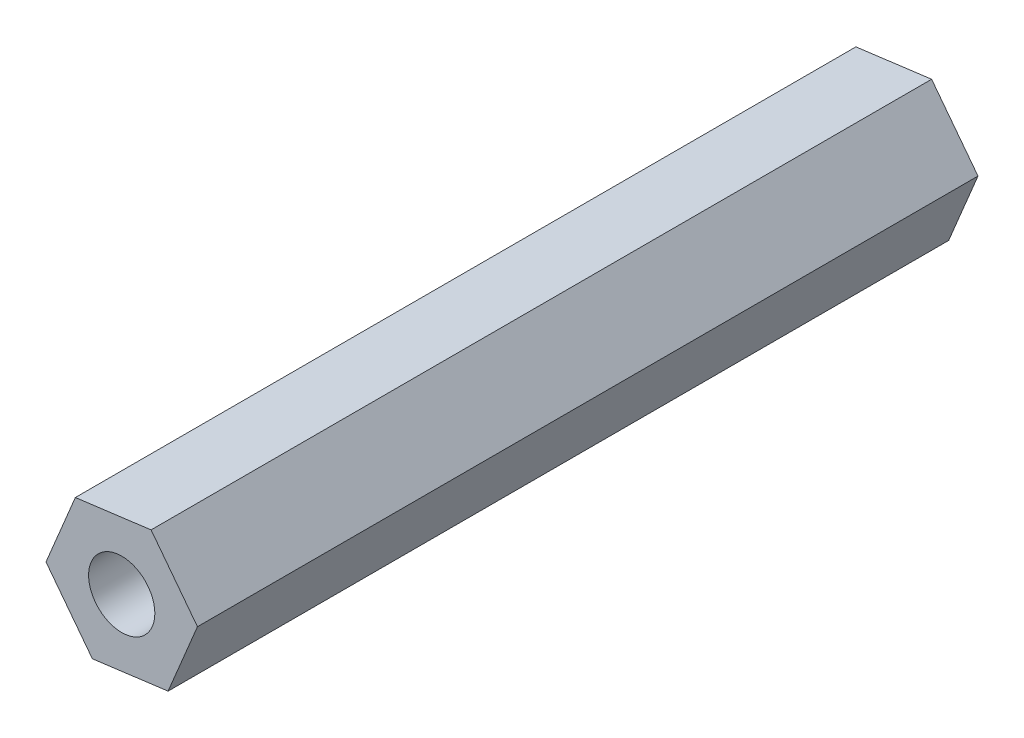
ISO-10303-21;
HEADER;
FILE_DESCRIPTION(('STEP AP214'),'2;1');
FILE_NAME('part.step','',(''),(''),'','','');
FILE_SCHEMA(('AUTOMOTIVE_DESIGN { 1 0 10303 214 1 1 1 1 }'));
ENDSEC;
DATA;
#1=APPLICATION_CONTEXT('core data for automotive mechanical design processes');
#2=APPLICATION_PROTOCOL_DEFINITION('international standard','automotive_design',2000,#1);
#3=PRODUCT_CONTEXT('',#1,'mechanical');
#4=PRODUCT('Part','Part','',(#3));
#5=PRODUCT_RELATED_PRODUCT_CATEGORY('part','',(#4));
#6=PRODUCT_DEFINITION_FORMATION('','',#4);
#7=PRODUCT_DEFINITION_CONTEXT('part definition',#1,'design');
#8=PRODUCT_DEFINITION('design','',#6,#7);
#9=PRODUCT_DEFINITION_SHAPE('','',#8);
#10=(LENGTH_UNIT() NAMED_UNIT(*) SI_UNIT(.MILLI.,.METRE.));
#11=(NAMED_UNIT(*) PLANE_ANGLE_UNIT() SI_UNIT($,.RADIAN.));
#12=(NAMED_UNIT(*) SI_UNIT($,.STERADIAN.) SOLID_ANGLE_UNIT());
#13=UNCERTAINTY_MEASURE_WITH_UNIT(LENGTH_MEASURE(1.E-05),#10,'distance_accuracy_value','');
#14=(GEOMETRIC_REPRESENTATION_CONTEXT(3) GLOBAL_UNCERTAINTY_ASSIGNED_CONTEXT((#13)) GLOBAL_UNIT_ASSIGNED_CONTEXT((#10,
#11,#12)) REPRESENTATION_CONTEXT('',''));
#15=CARTESIAN_POINT('',(0.,0.,0.));
#16=DIRECTION('',(0.,0.,1.));
#17=DIRECTION('',(1.,0.,0.));
#18=AXIS2_PLACEMENT_3D('',#15,#16,#17);
#19=CARTESIAN_POINT('',(0.,0.,-74.95));
#20=DIRECTION('',(0.,0.,-1.));
#21=DIRECTION('',(1.,0.,0.));
#22=AXIS2_PLACEMENT_3D('',#19,#20,#21);
#23=PLANE('',#22);
#24=DIRECTION('',(0.384520198768807,0.923116578086862,0.));
#25=VECTOR('',#24,1.);
#26=CARTESIAN_POINT('',(4.45207223514963,-5.8260094529912,-74.95));
#27=LINE('',#26,#25);
#28=CARTESIAN_POINT('',(4.45207223514963,-5.8260094529912,-74.95));
#29=VERTEX_POINT('',#28);
#30=CARTESIAN_POINT('',(7.27150830655346,0.942602928627349,-74.95));
#31=VERTEX_POINT('',#30);
#32=EDGE_CURVE('E135',#29,#31,#27,.T.);
#33=ORIENTED_EDGE('',*,*,#32,.F.);
#34=DIRECTION('',(0.991702506662188,0.1285540286414,0.));
#35=VECTOR('',#34,1.);
#36=CARTESIAN_POINT('',(-2.81943607140382,-6.76861238161854,-74.95));
#37=LINE('',#36,#35);
#38=CARTESIAN_POINT('',(-2.81943607140382,-6.76861238161854,-74.95));
#39=VERTEX_POINT('',#38);
#40=EDGE_CURVE('E115',#39,#29,#37,.T.);
#41=ORIENTED_EDGE('',*,*,#40,.F.);
#42=DIRECTION('',(0.607182307893379,-0.79456254944546,0.));
#43=VECTOR('',#42,1.);
#44=CARTESIAN_POINT('',(-7.27150830655346,-0.942602928627337,-74.95));
#45=LINE('',#44,#43);
#46=CARTESIAN_POINT('',(-7.27150830655346,-0.942602928627337,-74.95));
#47=VERTEX_POINT('',#46);
#48=EDGE_CURVE('E96',#47,#39,#45,.T.);
#49=ORIENTED_EDGE('',*,*,#48,.F.);
#50=DIRECTION('',(-0.384520198768808,-0.923116578086861,0.));
#51=VECTOR('',#50,1.);
#52=CARTESIAN_POINT('',(-4.45207223514962,5.8260094529912,-74.95));
#53=LINE('',#52,#51);
#54=CARTESIAN_POINT('',(-4.45207223514962,5.8260094529912,-74.95));
#55=VERTEX_POINT('',#54);
#56=EDGE_CURVE('E106',#55,#47,#53,.T.);
#57=ORIENTED_EDGE('',*,*,#56,.F.);
#58=DIRECTION('',(-0.991702506662188,-0.1285540286414,0.));
#59=VECTOR('',#58,1.);
#60=CARTESIAN_POINT('',(2.81943607140384,6.76861238161854,-74.95));
#61=LINE('',#60,#59);
#62=CARTESIAN_POINT('',(2.81943607140384,6.76861238161854,-74.95));
#63=VERTEX_POINT('',#62);
#64=EDGE_CURVE('E111',#63,#55,#61,.T.);
#65=ORIENTED_EDGE('',*,*,#64,.F.);
#66=DIRECTION('',(-0.607182307893379,0.79456254944546,0.));
#67=VECTOR('',#66,1.);
#68=CARTESIAN_POINT('',(7.27150830655346,0.942602928627349,-74.95));
#69=LINE('',#68,#67);
#70=EDGE_CURVE('E140',#31,#63,#69,.T.);
#71=ORIENTED_EDGE('',*,*,#70,.F.);
#72=EDGE_LOOP('',(#33,#41,#49,#57,#65,#71));
#73=FACE_BOUND('',#72,.T.);
#74=CARTESIAN_POINT('',(0.,0.,-74.95));
#75=DIRECTION('',(0.,0.,1.));
#76=DIRECTION('',(1.,0.,0.));
#77=AXIS2_PLACEMENT_3D('',#74,#75,#76);
#78=CIRCLE('',#77,3.18);
#79=CARTESIAN_POINT('',(3.18,0.,-74.95));
#80=VERTEX_POINT('',#79);
#81=EDGE_CURVE('E124',#80,#80,#78,.T.);
#82=ORIENTED_EDGE('',*,*,#81,.T.);
#83=EDGE_LOOP('',(#82));
#84=FACE_BOUND('',#83,.T.);
#85=ADVANCED_FACE('F35',(#73,#84),#23,.T.);
#86=CARTESIAN_POINT('',(0.,0.,0.));
#87=DIRECTION('',(0.,0.,-1.));
#88=DIRECTION('',(1.,0.,0.));
#89=AXIS2_PLACEMENT_3D('',#86,#87,#88);
#90=PLANE('',#89);
#91=DIRECTION('',(0.384520198768807,0.923116578086862,0.));
#92=VECTOR('',#91,1.);
#93=CARTESIAN_POINT('',(4.45207223514963,-5.8260094529912,0.));
#94=LINE('',#93,#92);
#95=CARTESIAN_POINT('',(4.45207223514963,-5.8260094529912,0.));
#96=VERTEX_POINT('',#95);
#97=CARTESIAN_POINT('',(7.27150830655346,0.942602928627349,0.));
#98=VERTEX_POINT('',#97);
#99=EDGE_CURVE('E120',#96,#98,#94,.T.);
#100=ORIENTED_EDGE('',*,*,#99,.T.);
#101=DIRECTION('',(-0.607182307893379,0.79456254944546,0.));
#102=VECTOR('',#101,1.);
#103=CARTESIAN_POINT('',(7.27150830655346,0.942602928627349,0.));
#104=LINE('',#103,#102);
#105=CARTESIAN_POINT('',(2.81943607140384,6.76861238161854,0.));
#106=VERTEX_POINT('',#105);
#107=EDGE_CURVE('E123',#98,#106,#104,.T.);
#108=ORIENTED_EDGE('',*,*,#107,.T.);
#109=DIRECTION('',(-0.991702506662188,-0.1285540286414,0.));
#110=VECTOR('',#109,1.);
#111=CARTESIAN_POINT('',(2.81943607140384,6.76861238161854,0.));
#112=LINE('',#111,#110);
#113=CARTESIAN_POINT('',(-4.45207223514962,5.8260094529912,0.));
#114=VERTEX_POINT('',#113);
#115=EDGE_CURVE('E127',#106,#114,#112,.T.);
#116=ORIENTED_EDGE('',*,*,#115,.T.);
#117=DIRECTION('',(-0.384520198768808,-0.923116578086861,0.));
#118=VECTOR('',#117,1.);
#119=CARTESIAN_POINT('',(-4.45207223514962,5.8260094529912,0.));
#120=LINE('',#119,#118);
#121=CARTESIAN_POINT('',(-7.27150830655346,-0.942602928627337,0.));
#122=VERTEX_POINT('',#121);
#123=EDGE_CURVE('E130',#114,#122,#120,.T.);
#124=ORIENTED_EDGE('',*,*,#123,.T.);
#125=DIRECTION('',(0.607182307893379,-0.79456254944546,0.));
#126=VECTOR('',#125,1.);
#127=CARTESIAN_POINT('',(-7.27150830655346,-0.942602928627337,0.));
#128=LINE('',#127,#126);
#129=CARTESIAN_POINT('',(-2.81943607140382,-6.76861238161854,0.));
#130=VERTEX_POINT('',#129);
#131=EDGE_CURVE('E99',#122,#130,#128,.T.);
#132=ORIENTED_EDGE('',*,*,#131,.T.);
#133=DIRECTION('',(0.991702506662188,0.1285540286414,0.));
#134=VECTOR('',#133,1.);
#135=CARTESIAN_POINT('',(-2.81943607140382,-6.76861238161854,0.));
#136=LINE('',#135,#134);
#137=EDGE_CURVE('E133',#130,#96,#136,.T.);
#138=ORIENTED_EDGE('',*,*,#137,.T.);
#139=EDGE_LOOP('',(#100,#108,#116,#124,#132,#138));
#140=FACE_BOUND('',#139,.T.);
#141=CARTESIAN_POINT('',(0.,0.,0.));
#142=DIRECTION('',(0.,0.,1.));
#143=DIRECTION('',(1.,0.,0.));
#144=AXIS2_PLACEMENT_3D('',#141,#142,#143);
#145=CIRCLE('',#144,3.18);
#146=CARTESIAN_POINT('',(3.18,0.,0.));
#147=VERTEX_POINT('',#146);
#148=EDGE_CURVE('E149',#147,#147,#145,.T.);
#149=ORIENTED_EDGE('',*,*,#148,.F.);
#150=EDGE_LOOP('',(#149));
#151=FACE_BOUND('',#150,.T.);
#152=ADVANCED_FACE('F144',(#140,#151),#90,.F.);
#153=CARTESIAN_POINT('',(4.45207223514963,-5.8260094529912,-74.95));
#154=DIRECTION('',(-0.923116578086862,0.384520198768807,0.));
#155=DIRECTION('',(-0.384520198768807,-0.923116578086862,0.));
#156=AXIS2_PLACEMENT_3D('',#153,#154,#155);
#157=PLANE('',#156);
#158=ORIENTED_EDGE('',*,*,#99,.F.);
#159=DIRECTION('',(0.,0.,1.));
#160=VECTOR('',#159,1.);
#161=CARTESIAN_POINT('',(4.45207223514963,-5.8260094529912,-74.95));
#162=LINE('',#161,#160);
#163=EDGE_CURVE('E52',#29,#96,#162,.T.);
#164=ORIENTED_EDGE('',*,*,#163,.F.);
#165=ORIENTED_EDGE('',*,*,#32,.T.);
#166=DIRECTION('',(0.,0.,1.));
#167=VECTOR('',#166,1.);
#168=CARTESIAN_POINT('',(7.27150830655346,0.942602928627349,-74.95));
#169=LINE('',#168,#167);
#170=EDGE_CURVE('E11',#31,#98,#169,.T.);
#171=ORIENTED_EDGE('',*,*,#170,.T.);
#172=EDGE_LOOP('',(#158,#164,#165,#171));
#173=FACE_BOUND('',#172,.T.);
#174=ADVANCED_FACE('F37',(#173),#157,.F.);
#175=CARTESIAN_POINT('',(7.27150830655346,0.942602928627349,-74.95));
#176=DIRECTION('',(-0.79456254944546,-0.607182307893379,0.));
#177=DIRECTION('',(0.607182307893379,-0.79456254944546,0.));
#178=AXIS2_PLACEMENT_3D('',#175,#176,#177);
#179=PLANE('',#178);
#180=ORIENTED_EDGE('',*,*,#107,.F.);
#181=ORIENTED_EDGE('',*,*,#170,.F.);
#182=ORIENTED_EDGE('',*,*,#70,.T.);
#183=DIRECTION('',(0.,0.,1.));
#184=VECTOR('',#183,1.);
#185=CARTESIAN_POINT('',(2.81943607140384,6.76861238161854,-74.95));
#186=LINE('',#185,#184);
#187=EDGE_CURVE('E44',#63,#106,#186,.T.);
#188=ORIENTED_EDGE('',*,*,#187,.T.);
#189=EDGE_LOOP('',(#180,#181,#182,#188));
#190=FACE_BOUND('',#189,.T.);
#191=ADVANCED_FACE('F139',(#190),#179,.F.);
#192=CARTESIAN_POINT('',(2.81943607140384,6.76861238161854,-74.95));
#193=DIRECTION('',(0.1285540286414,-0.991702506662188,0.));
#194=DIRECTION('',(0.991702506662188,0.1285540286414,0.));
#195=AXIS2_PLACEMENT_3D('',#192,#193,#194);
#196=PLANE('',#195);
#197=ORIENTED_EDGE('',*,*,#115,.F.);
#198=ORIENTED_EDGE('',*,*,#187,.F.);
#199=ORIENTED_EDGE('',*,*,#64,.T.);
#200=DIRECTION('',(0.,0.,1.));
#201=VECTOR('',#200,1.);
#202=CARTESIAN_POINT('',(-4.45207223514962,5.8260094529912,-74.95));
#203=LINE('',#202,#201);
#204=EDGE_CURVE('E103',#55,#114,#203,.T.);
#205=ORIENTED_EDGE('',*,*,#204,.T.);
#206=EDGE_LOOP('',(#197,#198,#199,#205));
#207=FACE_BOUND('',#206,.T.);
#208=ADVANCED_FACE('F142',(#207),#196,.F.);
#209=CARTESIAN_POINT('',(-4.45207223514962,5.8260094529912,-74.95));
#210=DIRECTION('',(0.923116578086861,-0.384520198768808,0.));
#211=DIRECTION('',(0.384520198768808,0.923116578086861,0.));
#212=AXIS2_PLACEMENT_3D('',#209,#210,#211);
#213=PLANE('',#212);
#214=ORIENTED_EDGE('',*,*,#123,.F.);
#215=ORIENTED_EDGE('',*,*,#204,.F.);
#216=ORIENTED_EDGE('',*,*,#56,.T.);
#217=DIRECTION('',(0.,0.,1.));
#218=VECTOR('',#217,1.);
#219=CARTESIAN_POINT('',(-7.27150830655346,-0.942602928627337,-74.95));
#220=LINE('',#219,#218);
#221=EDGE_CURVE('E92',#47,#122,#220,.T.);
#222=ORIENTED_EDGE('',*,*,#221,.T.);
#223=EDGE_LOOP('',(#214,#215,#216,#222));
#224=FACE_BOUND('',#223,.T.);
#225=ADVANCED_FACE('F107',(#224),#213,.F.);
#226=CARTESIAN_POINT('',(-7.27150830655346,-0.942602928627337,-74.95));
#227=DIRECTION('',(0.79456254944546,0.607182307893379,0.));
#228=DIRECTION('',(-0.607182307893379,0.794562549445461,0.));
#229=AXIS2_PLACEMENT_3D('',#226,#227,#228);
#230=PLANE('',#229);
#231=ORIENTED_EDGE('',*,*,#131,.F.);
#232=ORIENTED_EDGE('',*,*,#221,.F.);
#233=ORIENTED_EDGE('',*,*,#48,.T.);
#234=DIRECTION('',(0.,0.,1.));
#235=VECTOR('',#234,1.);
#236=CARTESIAN_POINT('',(-2.81943607140382,-6.76861238161854,-74.95));
#237=LINE('',#236,#235);
#238=EDGE_CURVE('E74',#39,#130,#237,.T.);
#239=ORIENTED_EDGE('',*,*,#238,.T.);
#240=EDGE_LOOP('',(#231,#232,#233,#239));
#241=FACE_BOUND('',#240,.T.);
#242=ADVANCED_FACE('F94',(#241),#230,.F.);
#243=CARTESIAN_POINT('',(-2.81943607140382,-6.76861238161854,-74.95));
#244=DIRECTION('',(-0.1285540286414,0.991702506662188,0.));
#245=DIRECTION('',(-0.991702506662188,-0.1285540286414,0.));
#246=AXIS2_PLACEMENT_3D('',#243,#244,#245);
#247=PLANE('',#246);
#248=ORIENTED_EDGE('',*,*,#137,.F.);
#249=ORIENTED_EDGE('',*,*,#238,.F.);
#250=ORIENTED_EDGE('',*,*,#40,.T.);
#251=ORIENTED_EDGE('',*,*,#163,.T.);
#252=EDGE_LOOP('',(#248,#249,#250,#251));
#253=FACE_BOUND('',#252,.T.);
#254=ADVANCED_FACE('F158',(#253),#247,.F.);
#255=CARTESIAN_POINT('',(0.,0.,-74.95));
#256=DIRECTION('',(0.,0.,1.));
#257=DIRECTION('',(-1.,0.,0.));
#258=AXIS2_PLACEMENT_3D('',#255,#256,#257);
#259=CYLINDRICAL_SURFACE('',#258,3.18);
#260=ORIENTED_EDGE('',*,*,#81,.F.);
#261=EDGE_LOOP('',(#260));
#262=FACE_BOUND('',#261,.T.);
#263=ORIENTED_EDGE('',*,*,#148,.T.);
#264=EDGE_LOOP('',(#263));
#265=FACE_BOUND('',#264,.T.);
#266=ADVANCED_FACE('F155',(#262,#265),#259,.F.);
#267=CLOSED_SHELL('',(#85,#152,#174,#191,#208,#225,#242,#254,#266));
#268=MANIFOLD_SOLID_BREP('B2',#267);
#269=ADVANCED_BREP_SHAPE_REPRESENTATION('',(#18,#268),#14);
#270=SHAPE_DEFINITION_REPRESENTATION(#9,#269);
ENDSEC;
END-ISO-10303-21;
